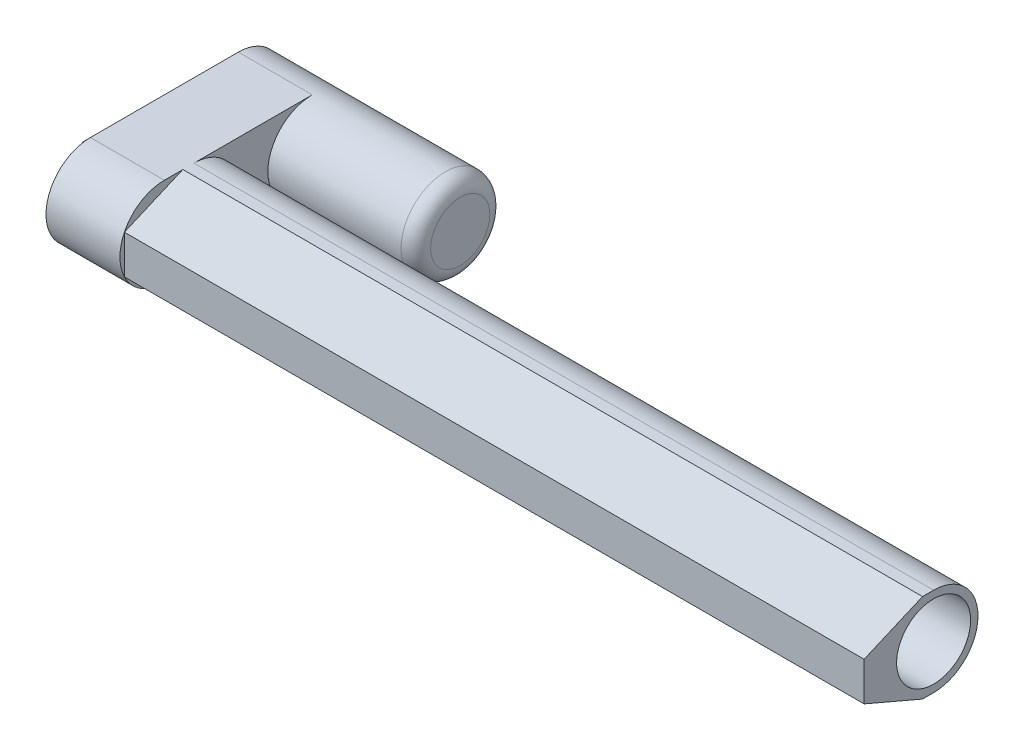
ISO-10303-21;
HEADER;
FILE_DESCRIPTION(('STEP AP214'),'2;1');
FILE_NAME('part.step','',(''),(''),'','','');
FILE_SCHEMA(('AUTOMOTIVE_DESIGN { 1 0 10303 214 1 1 1 1 }'));
ENDSEC;
DATA;
#1=APPLICATION_CONTEXT('core data for automotive mechanical design processes');
#2=APPLICATION_PROTOCOL_DEFINITION('international standard','automotive_design',2000,#1);
#3=PRODUCT_CONTEXT('',#1,'mechanical');
#4=PRODUCT('Part','Part','',(#3));
#5=PRODUCT_RELATED_PRODUCT_CATEGORY('part','',(#4));
#6=PRODUCT_DEFINITION_FORMATION('','',#4);
#7=PRODUCT_DEFINITION_CONTEXT('part definition',#1,'design');
#8=PRODUCT_DEFINITION('design','',#6,#7);
#9=PRODUCT_DEFINITION_SHAPE('','',#8);
#10=(LENGTH_UNIT() NAMED_UNIT(*) SI_UNIT(.MILLI.,.METRE.));
#11=(NAMED_UNIT(*) PLANE_ANGLE_UNIT() SI_UNIT($,.RADIAN.));
#12=(NAMED_UNIT(*) SI_UNIT($,.STERADIAN.) SOLID_ANGLE_UNIT());
#13=UNCERTAINTY_MEASURE_WITH_UNIT(LENGTH_MEASURE(1.E-05),#10,'distance_accuracy_value','');
#14=(GEOMETRIC_REPRESENTATION_CONTEXT(3) GLOBAL_UNCERTAINTY_ASSIGNED_CONTEXT((#13)) GLOBAL_UNIT_ASSIGNED_CONTEXT((#10,
#11,#12)) REPRESENTATION_CONTEXT('',''));
#15=CARTESIAN_POINT('',(0.,0.,0.));
#16=DIRECTION('',(0.,0.,1.));
#17=DIRECTION('',(1.,0.,0.));
#18=AXIS2_PLACEMENT_3D('',#15,#16,#17);
#19=CARTESIAN_POINT('',(0.,0.,0.));
#20=DIRECTION('',(1.,0.,0.));
#21=DIRECTION('',(0.,0.,-1.));
#22=AXIS2_PLACEMENT_3D('',#19,#20,#21);
#23=PLANE('',#22);
#24=DIRECTION('',(0.,1.,0.));
#25=VECTOR('',#24,1.);
#26=CARTESIAN_POINT('',(0.,-9.99999999999999,0.));
#27=LINE('',#26,#25);
#28=CARTESIAN_POINT('',(0.,-30.,0.));
#29=VERTEX_POINT('',#28);
#30=CARTESIAN_POINT('',(0.,-9.99999999999999,0.));
#31=VERTEX_POINT('',#30);
#32=EDGE_CURVE('E176',#29,#31,#27,.T.);
#33=ORIENTED_EDGE('',*,*,#32,.F.);
#34=CARTESIAN_POINT('',(0.,0.,0.));
#35=DIRECTION('',(1.,0.,0.));
#36=DIRECTION('',(0.,0.,-1.));
#37=AXIS2_PLACEMENT_3D('',#34,#35,#36);
#38=CIRCLE('',#37,30.);
#39=CARTESIAN_POINT('',(0.,30.,0.));
#40=VERTEX_POINT('',#39);
#41=EDGE_CURVE('E253',#40,#29,#38,.T.);
#42=ORIENTED_EDGE('',*,*,#41,.F.);
#43=DIRECTION('',(0.,0.,-1.));
#44=VECTOR('',#43,1.);
#45=CARTESIAN_POINT('',(0.,30.,0.));
#46=LINE('',#45,#44);
#47=CARTESIAN_POINT('',(0.,30.,-100.));
#48=VERTEX_POINT('',#47);
#49=EDGE_CURVE('E257',#40,#48,#46,.T.);
#50=ORIENTED_EDGE('',*,*,#49,.T.);
#51=CARTESIAN_POINT('',(0.,0.,-100.));
#52=DIRECTION('',(1.,0.,0.));
#53=DIRECTION('',(0.,0.,-1.));
#54=AXIS2_PLACEMENT_3D('',#51,#52,#53);
#55=CIRCLE('',#54,30.);
#56=CARTESIAN_POINT('',(0.,-30.,-100.));
#57=VERTEX_POINT('',#56);
#58=EDGE_CURVE('E262',#57,#48,#55,.T.);
#59=ORIENTED_EDGE('',*,*,#58,.F.);
#60=DIRECTION('',(0.,-1.,0.));
#61=VECTOR('',#60,1.);
#62=CARTESIAN_POINT('',(0.,-10.,-100.));
#63=LINE('',#62,#61);
#64=CARTESIAN_POINT('',(0.,-10.,-100.));
#65=VERTEX_POINT('',#64);
#66=EDGE_CURVE('E172',#65,#57,#63,.T.);
#67=ORIENTED_EDGE('',*,*,#66,.F.);
#68=DIRECTION('',(0.,0.,-1.));
#69=VECTOR('',#68,1.);
#70=CARTESIAN_POINT('',(0.,-9.99999999999999,0.));
#71=LINE('',#70,#69);
#72=EDGE_CURVE('E179',#31,#65,#71,.T.);
#73=ORIENTED_EDGE('',*,*,#72,.F.);
#74=EDGE_LOOP('',(#33,#42,#50,#59,#67,#73));
#75=FACE_BOUND('',#74,.T.);
#76=ADVANCED_FACE('F44',(#75),#23,.F.);
#77=CARTESIAN_POINT('',(50.,0.,0.));
#78=DIRECTION('',(-1.,0.,0.));
#79=DIRECTION('',(0.,0.,1.));
#80=AXIS2_PLACEMENT_3D('',#77,#78,#79);
#81=CYLINDRICAL_SURFACE('',#80,30.);
#82=CARTESIAN_POINT('',(50.,0.,0.));
#83=DIRECTION('',(1.,0.,0.));
#84=DIRECTION('',(0.,0.,-1.));
#85=AXIS2_PLACEMENT_3D('',#82,#83,#84);
#86=CIRCLE('',#85,30.);
#87=CARTESIAN_POINT('',(50.,13.076696830622,27.));
#88=VERTEX_POINT('',#87);
#89=CARTESIAN_POINT('',(50.,-13.076696830622,27.));
#90=VERTEX_POINT('',#89);
#91=EDGE_CURVE('E192',#88,#90,#86,.T.);
#92=ORIENTED_EDGE('',*,*,#91,.F.);
#93=CARTESIAN_POINT('',(50.,0.,0.));
#94=DIRECTION('',(1.,0.,0.));
#95=DIRECTION('',(0.,0.,-1.));
#96=AXIS2_PLACEMENT_3D('',#93,#94,#95);
#97=CIRCLE('',#96,30.);
#98=CARTESIAN_POINT('',(50.,30.,0.));
#99=VERTEX_POINT('',#98);
#100=EDGE_CURVE('E204',#99,#88,#97,.T.);
#101=ORIENTED_EDGE('',*,*,#100,.F.);
#102=DIRECTION('',(-1.,0.,0.));
#103=VECTOR('',#102,1.);
#104=CARTESIAN_POINT('',(50.,30.,0.));
#105=LINE('',#104,#103);
#106=EDGE_CURVE('E259',#99,#40,#105,.T.);
#107=ORIENTED_EDGE('',*,*,#106,.T.);
#108=ORIENTED_EDGE('',*,*,#41,.T.);
#109=DIRECTION('',(-1.,0.,0.));
#110=VECTOR('',#109,1.);
#111=CARTESIAN_POINT('',(50.,-30.,0.));
#112=LINE('',#111,#110);
#113=CARTESIAN_POINT('',(50.,-30.,0.));
#114=VERTEX_POINT('',#113);
#115=EDGE_CURVE('E273',#114,#29,#112,.T.);
#116=ORIENTED_EDGE('',*,*,#115,.F.);
#117=CARTESIAN_POINT('',(50.,0.,0.));
#118=DIRECTION('',(1.,0.,0.));
#119=DIRECTION('',(0.,0.,-1.));
#120=AXIS2_PLACEMENT_3D('',#117,#118,#119);
#121=CIRCLE('',#120,30.);
#122=EDGE_CURVE('E219',#90,#114,#121,.T.);
#123=ORIENTED_EDGE('',*,*,#122,.F.);
#124=EDGE_LOOP('',(#92,#101,#107,#108,#116,#123));
#125=FACE_BOUND('',#124,.T.);
#126=ADVANCED_FACE('F317',(#125),#81,.T.);
#127=CARTESIAN_POINT('',(550.,0.,0.));
#128=DIRECTION('',(1.,0.,0.));
#129=DIRECTION('',(0.,0.,-1.));
#130=AXIS2_PLACEMENT_3D('',#127,#128,#129);
#131=PLANE('',#130);
#132=CARTESIAN_POINT('',(550.,0.,-20.));
#133=DIRECTION('',(1.,0.,0.));
#134=DIRECTION('',(0.,0.,-1.));
#135=AXIS2_PLACEMENT_3D('',#132,#133,#134);
#136=CIRCLE('',#135,25.);
#137=CARTESIAN_POINT('',(550.,0.,-45.));
#138=VERTEX_POINT('',#137);
#139=EDGE_CURVE('E214',#138,#138,#136,.T.);
#140=ORIENTED_EDGE('',*,*,#139,.F.);
#141=EDGE_LOOP('',(#140));
#142=FACE_BOUND('',#141,.T.);
#143=DIRECTION('',(0.,-0.393565189985534,0.919296710116843));
#144=VECTOR('',#143,1.);
#145=CARTESIAN_POINT('',(550.,20.8198866995879,8.91331664110835));
#146=LINE('',#145,#144);
#147=CARTESIAN_POINT('',(550.,30.,-12.5297585350243));
#148=VERTEX_POINT('',#147);
#149=CARTESIAN_POINT('',(550.,13.076696830622,27.));
#150=VERTEX_POINT('',#149);
#151=EDGE_CURVE('E202',#148,#150,#146,.T.);
#152=ORIENTED_EDGE('',*,*,#151,.T.);
#153=DIRECTION('',(0.,-1.,0.));
#154=VECTOR('',#153,1.);
#155=CARTESIAN_POINT('',(550.,0.,27.));
#156=LINE('',#155,#154);
#157=CARTESIAN_POINT('',(550.,-13.076696830622,27.));
#158=VERTEX_POINT('',#157);
#159=EDGE_CURVE('E189',#150,#158,#156,.T.);
#160=ORIENTED_EDGE('',*,*,#159,.T.);
#161=DIRECTION('',(0.,-0.393565189985534,-0.919296710116843));
#162=VECTOR('',#161,1.);
#163=CARTESIAN_POINT('',(550.,-20.8198866995879,8.91331664110835));
#164=LINE('',#163,#162);
#165=CARTESIAN_POINT('',(550.,-30.,-12.5297585350242));
#166=VERTEX_POINT('',#165);
#167=EDGE_CURVE('E195',#158,#166,#164,.T.);
#168=ORIENTED_EDGE('',*,*,#167,.T.);
#169=DIRECTION('',(0.,0.,-1.));
#170=VECTOR('',#169,1.);
#171=CARTESIAN_POINT('',(550.,-30.,0.));
#172=LINE('',#171,#170);
#173=CARTESIAN_POINT('',(550.,-30.,-20.));
#174=VERTEX_POINT('',#173);
#175=EDGE_CURVE('E235',#166,#174,#172,.T.);
#176=ORIENTED_EDGE('',*,*,#175,.T.);
#177=CARTESIAN_POINT('',(550.,0.,-20.));
#178=DIRECTION('',(1.,0.,0.));
#179=DIRECTION('',(0.,0.,-1.));
#180=AXIS2_PLACEMENT_3D('',#177,#178,#179);
#181=CIRCLE('',#180,30.);
#182=CARTESIAN_POINT('',(550.,30.,-20.));
#183=VERTEX_POINT('',#182);
#184=EDGE_CURVE('E237',#174,#183,#181,.T.);
#185=ORIENTED_EDGE('',*,*,#184,.T.);
#186=DIRECTION('',(0.,0.,1.));
#187=VECTOR('',#186,1.);
#188=CARTESIAN_POINT('',(550.,30.,0.));
#189=LINE('',#188,#187);
#190=EDGE_CURVE('E239',#183,#148,#189,.T.);
#191=ORIENTED_EDGE('',*,*,#190,.T.);
#192=EDGE_LOOP('',(#152,#160,#168,#176,#185,#191));
#193=FACE_BOUND('',#192,.T.);
#194=ADVANCED_FACE('F346',(#142,#193),#131,.T.);
#195=CARTESIAN_POINT('',(50.,-30.,0.));
#196=DIRECTION('',(0.,1.,0.));
#197=DIRECTION('',(0.,0.,1.));
#198=AXIS2_PLACEMENT_3D('',#195,#196,#197);
#199=PLANE('',#198);
#200=CARTESIAN_POINT('',(-20.,-30.,-25.));
#201=DIRECTION('',(0.,-1.,0.));
#202=DIRECTION('',(0.,0.,-1.));
#203=AXIS2_PLACEMENT_3D('',#200,#201,#202);
#204=CIRCLE('',#203,10.);
#205=CARTESIAN_POINT('',(-20.,-30.,-35.));
#206=VERTEX_POINT('',#205);
#207=EDGE_CURVE('E283',#206,#206,#204,.T.);
#208=ORIENTED_EDGE('',*,*,#207,.F.);
#209=EDGE_LOOP('',(#208));
#210=FACE_BOUND('',#209,.T.);
#211=CARTESIAN_POINT('',(-20.,-30.,-75.));
#212=DIRECTION('',(0.,-1.,0.));
#213=DIRECTION('',(0.,0.,-1.));
#214=AXIS2_PLACEMENT_3D('',#211,#212,#213);
#215=CIRCLE('',#214,9.99999999999999);
#216=CARTESIAN_POINT('',(-20.,-30.,-85.));
#217=VERTEX_POINT('',#216);
#218=EDGE_CURVE('E288',#217,#217,#215,.T.);
#219=ORIENTED_EDGE('',*,*,#218,.F.);
#220=EDGE_LOOP('',(#219));
#221=FACE_BOUND('',#220,.T.);
#222=DIRECTION('',(1.,0.,0.));
#223=VECTOR('',#222,1.);
#224=CARTESIAN_POINT('',(-40.,-30.,0.));
#225=LINE('',#224,#223);
#226=CARTESIAN_POINT('',(-25.,-30.,0.));
#227=VERTEX_POINT('',#226);
#228=EDGE_CURVE('E163',#227,#29,#225,.T.);
#229=ORIENTED_EDGE('',*,*,#228,.F.);
#230=DIRECTION('',(0.393919298579168,0.,0.919145030018058));
#231=VECTOR('',#230,1.);
#232=CARTESIAN_POINT('',(-40.,-30.,-35.));
#233=LINE('',#232,#231);
#234=CARTESIAN_POINT('',(-40.,-30.,-35.));
#235=VERTEX_POINT('',#234);
#236=EDGE_CURVE('E151',#235,#227,#233,.T.);
#237=ORIENTED_EDGE('',*,*,#236,.F.);
#238=DIRECTION('',(0.,0.,1.));
#239=VECTOR('',#238,1.);
#240=CARTESIAN_POINT('',(-40.,-30.,0.));
#241=LINE('',#240,#239);
#242=CARTESIAN_POINT('',(-40.,-30.,-65.));
#243=VERTEX_POINT('',#242);
#244=EDGE_CURVE('E161',#243,#235,#241,.T.);
#245=ORIENTED_EDGE('',*,*,#244,.F.);
#246=DIRECTION('',(-0.393919298579167,0.,0.919145030018058));
#247=VECTOR('',#246,1.);
#248=CARTESIAN_POINT('',(-40.,-30.,-65.));
#249=LINE('',#248,#247);
#250=CARTESIAN_POINT('',(-25.,-30.,-100.));
#251=VERTEX_POINT('',#250);
#252=EDGE_CURVE('E61',#251,#243,#249,.T.);
#253=ORIENTED_EDGE('',*,*,#252,.F.);
#254=DIRECTION('',(1.,0.,0.));
#255=VECTOR('',#254,1.);
#256=CARTESIAN_POINT('',(-40.,-30.,-100.));
#257=LINE('',#256,#255);
#258=EDGE_CURVE('E170',#251,#57,#257,.T.);
#259=ORIENTED_EDGE('',*,*,#258,.T.);
#260=DIRECTION('',(-1.,0.,0.));
#261=VECTOR('',#260,1.);
#262=CARTESIAN_POINT('',(50.,-30.,-100.));
#263=LINE('',#262,#261);
#264=CARTESIAN_POINT('',(50.,-30.,-100.));
#265=VERTEX_POINT('',#264);
#266=EDGE_CURVE('E270',#265,#57,#263,.T.);
#267=ORIENTED_EDGE('',*,*,#266,.F.);
#268=DIRECTION('',(0.,0.,-1.));
#269=VECTOR('',#268,1.);
#270=CARTESIAN_POINT('',(50.,-30.,0.));
#271=LINE('',#270,#269);
#272=CARTESIAN_POINT('',(50.,-30.,-20.));
#273=VERTEX_POINT('',#272);
#274=EDGE_CURVE('E254',#273,#265,#271,.T.);
#275=ORIENTED_EDGE('',*,*,#274,.F.);
#276=DIRECTION('',(-1.,0.,0.));
#277=VECTOR('',#276,1.);
#278=CARTESIAN_POINT('',(550.,-30.,-20.));
#279=LINE('',#278,#277);
#280=EDGE_CURVE('E247',#174,#273,#279,.T.);
#281=ORIENTED_EDGE('',*,*,#280,.F.);
#282=ORIENTED_EDGE('',*,*,#175,.F.);
#283=DIRECTION('',(1.,0.,0.));
#284=VECTOR('',#283,1.);
#285=CARTESIAN_POINT('',(50.,-30.,-12.5297585350242));
#286=LINE('',#285,#284);
#287=CARTESIAN_POINT('',(50.,-30.,-12.5297585350242));
#288=VERTEX_POINT('',#287);
#289=EDGE_CURVE('E210',#288,#166,#286,.T.);
#290=ORIENTED_EDGE('',*,*,#289,.F.);
#291=DIRECTION('',(0.,0.,-1.));
#292=VECTOR('',#291,1.);
#293=CARTESIAN_POINT('',(50.,-30.,0.));
#294=LINE('',#293,#292);
#295=EDGE_CURVE('E221',#114,#288,#294,.T.);
#296=ORIENTED_EDGE('',*,*,#295,.F.);
#297=ORIENTED_EDGE('',*,*,#115,.T.);
#298=EDGE_LOOP('',(#229,#237,#245,#253,#259,#267,#275,#281,#282,#290,#296,#297));
#299=FACE_BOUND('',#298,.T.);
#300=ADVANCED_FACE('F160',(#210,#221,#299),#199,.F.);
#301=CARTESIAN_POINT('',(50.,30.,0.));
#302=DIRECTION('',(0.,1.,0.));
#303=DIRECTION('',(0.,0.,1.));
#304=AXIS2_PLACEMENT_3D('',#301,#302,#303);
#305=PLANE('',#304);
#306=DIRECTION('',(0.,0.,1.));
#307=VECTOR('',#306,1.);
#308=CARTESIAN_POINT('',(50.,30.,0.));
#309=LINE('',#308,#307);
#310=CARTESIAN_POINT('',(50.,30.,-12.5297585350243));
#311=VERTEX_POINT('',#310);
#312=EDGE_CURVE('E201',#311,#99,#309,.T.);
#313=ORIENTED_EDGE('',*,*,#312,.F.);
#314=DIRECTION('',(1.,0.,0.));
#315=VECTOR('',#314,1.);
#316=CARTESIAN_POINT('',(50.,30.,-12.5297585350243));
#317=LINE('',#316,#315);
#318=EDGE_CURVE('E207',#311,#148,#317,.T.);
#319=ORIENTED_EDGE('',*,*,#318,.T.);
#320=ORIENTED_EDGE('',*,*,#190,.F.);
#321=DIRECTION('',(-1.,0.,0.));
#322=VECTOR('',#321,1.);
#323=CARTESIAN_POINT('',(550.,30.,-20.));
#324=LINE('',#323,#322);
#325=CARTESIAN_POINT('',(50.,30.,-20.));
#326=VERTEX_POINT('',#325);
#327=EDGE_CURVE('E242',#183,#326,#324,.T.);
#328=ORIENTED_EDGE('',*,*,#327,.T.);
#329=DIRECTION('',(0.,0.,-1.));
#330=VECTOR('',#329,1.);
#331=CARTESIAN_POINT('',(50.,30.,0.));
#332=LINE('',#331,#330);
#333=CARTESIAN_POINT('',(50.,30.,-100.));
#334=VERTEX_POINT('',#333);
#335=EDGE_CURVE('E256',#326,#334,#332,.T.);
#336=ORIENTED_EDGE('',*,*,#335,.T.);
#337=DIRECTION('',(-1.,0.,0.));
#338=VECTOR('',#337,1.);
#339=CARTESIAN_POINT('',(50.,30.,-100.));
#340=LINE('',#339,#338);
#341=EDGE_CURVE('E268',#334,#48,#340,.T.);
#342=ORIENTED_EDGE('',*,*,#341,.T.);
#343=ORIENTED_EDGE('',*,*,#49,.F.);
#344=ORIENTED_EDGE('',*,*,#106,.F.);
#345=EDGE_LOOP('',(#313,#319,#320,#328,#336,#342,#343,#344));
#346=FACE_BOUND('',#345,.T.);
#347=ADVANCED_FACE('F322',(#346),#305,.T.);
#348=CARTESIAN_POINT('',(50.,0.,-100.));
#349=DIRECTION('',(-1.,0.,0.));
#350=DIRECTION('',(0.,0.,1.));
#351=AXIS2_PLACEMENT_3D('',#348,#349,#350);
#352=CYLINDRICAL_SURFACE('',#351,30.);
#353=CARTESIAN_POINT('',(140.,0.,-100.));
#354=DIRECTION('',(1.,0.,0.));
#355=DIRECTION('',(0.,0.,-1.));
#356=AXIS2_PLACEMENT_3D('',#353,#354,#355);
#357=CIRCLE('',#356,30.);
#358=CARTESIAN_POINT('',(140.,0.,-130.));
#359=VERTEX_POINT('',#358);
#360=EDGE_CURVE('E278',#359,#359,#357,.F.);
#361=ORIENTED_EDGE('',*,*,#360,.T.);
#362=EDGE_LOOP('',(#361));
#363=FACE_BOUND('',#362,.T.);
#364=ORIENTED_EDGE('',*,*,#58,.T.);
#365=ORIENTED_EDGE('',*,*,#341,.F.);
#366=CARTESIAN_POINT('',(50.,0.,-100.));
#367=DIRECTION('',(1.,0.,0.));
#368=DIRECTION('',(0.,0.,-1.));
#369=AXIS2_PLACEMENT_3D('',#366,#367,#368);
#370=CIRCLE('',#369,30.);
#371=EDGE_CURVE('E250',#334,#265,#370,.T.);
#372=ORIENTED_EDGE('',*,*,#371,.T.);
#373=ORIENTED_EDGE('',*,*,#266,.T.);
#374=EDGE_LOOP('',(#364,#365,#372,#373));
#375=FACE_BOUND('',#374,.T.);
#376=ADVANCED_FACE('F334',(#363,#375),#352,.T.);
#377=CARTESIAN_POINT('',(50.,0.,0.));
#378=DIRECTION('',(1.,0.,0.));
#379=DIRECTION('',(0.,0.,-1.));
#380=AXIS2_PLACEMENT_3D('',#377,#378,#379);
#381=PLANE('',#380);
#382=ORIENTED_EDGE('',*,*,#335,.F.);
#383=CARTESIAN_POINT('',(50.,0.,-20.));
#384=DIRECTION('',(1.,0.,0.));
#385=DIRECTION('',(0.,0.,-1.));
#386=AXIS2_PLACEMENT_3D('',#383,#384,#385);
#387=CIRCLE('',#386,30.);
#388=EDGE_CURVE('E232',#273,#326,#387,.T.);
#389=ORIENTED_EDGE('',*,*,#388,.F.);
#390=ORIENTED_EDGE('',*,*,#274,.T.);
#391=ORIENTED_EDGE('',*,*,#371,.F.);
#392=EDGE_LOOP('',(#382,#389,#390,#391));
#393=FACE_BOUND('',#392,.T.);
#394=ADVANCED_FACE('F337',(#393),#381,.T.);
#395=CARTESIAN_POINT('',(150.,0.,-100.));
#396=DIRECTION('',(1.,0.,0.));
#397=DIRECTION('',(0.,0.,-1.));
#398=AXIS2_PLACEMENT_3D('',#395,#396,#397);
#399=PLANE('',#398);
#400=CARTESIAN_POINT('',(150.,0.,-100.));
#401=DIRECTION('',(1.,0.,0.));
#402=DIRECTION('',(0.,0.,-1.));
#403=AXIS2_PLACEMENT_3D('',#400,#401,#402);
#404=CIRCLE('',#403,20.);
#405=CARTESIAN_POINT('',(150.,0.,-120.));
#406=VERTEX_POINT('',#405);
#407=EDGE_CURVE('E275',#406,#406,#404,.T.);
#408=ORIENTED_EDGE('',*,*,#407,.T.);
#409=EDGE_LOOP('',(#408));
#410=FACE_BOUND('',#409,.T.);
#411=ADVANCED_FACE('F429',(#410),#399,.T.);
#412=CARTESIAN_POINT('',(550.,0.,-20.));
#413=DIRECTION('',(-1.,0.,0.));
#414=DIRECTION('',(0.,0.,1.));
#415=AXIS2_PLACEMENT_3D('',#412,#413,#414);
#416=CYLINDRICAL_SURFACE('',#415,30.);
#417=ORIENTED_EDGE('',*,*,#388,.T.);
#418=ORIENTED_EDGE('',*,*,#327,.F.);
#419=ORIENTED_EDGE('',*,*,#184,.F.);
#420=ORIENTED_EDGE('',*,*,#280,.T.);
#421=EDGE_LOOP('',(#417,#418,#419,#420));
#422=FACE_BOUND('',#421,.T.);
#423=ADVANCED_FACE('F342',(#422),#416,.T.);
#424=CARTESIAN_POINT('',(50.,0.,-20.));
#425=DIRECTION('',(1.,0.,0.));
#426=DIRECTION('',(0.,0.,-1.));
#427=AXIS2_PLACEMENT_3D('',#424,#425,#426);
#428=CYLINDRICAL_SURFACE('',#427,25.);
#429=CARTESIAN_POINT('',(50.,0.,-20.));
#430=DIRECTION('',(1.,0.,0.));
#431=DIRECTION('',(0.,0.,-1.));
#432=AXIS2_PLACEMENT_3D('',#429,#430,#431);
#433=CIRCLE('',#432,25.);
#434=CARTESIAN_POINT('',(50.,0.,-45.));
#435=VERTEX_POINT('',#434);
#436=EDGE_CURVE('E229',#435,#435,#433,.T.);
#437=ORIENTED_EDGE('',*,*,#436,.F.);
#438=EDGE_LOOP('',(#437));
#439=FACE_BOUND('',#438,.T.);
#440=ORIENTED_EDGE('',*,*,#139,.T.);
#441=EDGE_LOOP('',(#440));
#442=FACE_BOUND('',#441,.T.);
#443=ADVANCED_FACE('F435',(#439,#442),#428,.F.);
#444=CARTESIAN_POINT('',(50.,0.,-20.));
#445=DIRECTION('',(1.,0.,0.));
#446=DIRECTION('',(0.,0.,-1.));
#447=AXIS2_PLACEMENT_3D('',#444,#445,#446);
#448=PLANE('',#447);
#449=ORIENTED_EDGE('',*,*,#436,.T.);
#450=EDGE_LOOP('',(#449));
#451=FACE_BOUND('',#450,.T.);
#452=ADVANCED_FACE('F440',(#451),#448,.T.);
#453=CARTESIAN_POINT('',(50.,-20.8198866995879,8.91331664110835));
#454=DIRECTION('',(0.,-0.919296710116843,0.393565189985534));
#455=DIRECTION('',(0.,-0.393565189985534,-0.919296710116843));
#456=AXIS2_PLACEMENT_3D('',#453,#454,#455);
#457=PLANE('',#456);
#458=ORIENTED_EDGE('',*,*,#167,.F.);
#459=DIRECTION('',(1.,0.,0.));
#460=VECTOR('',#459,1.);
#461=CARTESIAN_POINT('',(50.,-13.076696830622,27.));
#462=LINE('',#461,#460);
#463=EDGE_CURVE('E224',#90,#158,#462,.T.);
#464=ORIENTED_EDGE('',*,*,#463,.F.);
#465=DIRECTION('',(0.,-0.393565189985534,-0.919296710116843));
#466=VECTOR('',#465,1.);
#467=CARTESIAN_POINT('',(50.,-20.8198866995879,8.91331664110835));
#468=LINE('',#467,#466);
#469=EDGE_CURVE('E217',#90,#288,#468,.T.);
#470=ORIENTED_EDGE('',*,*,#469,.T.);
#471=ORIENTED_EDGE('',*,*,#289,.T.);
#472=EDGE_LOOP('',(#458,#464,#470,#471));
#473=FACE_BOUND('',#472,.T.);
#474=ADVANCED_FACE('F349',(#473),#457,.T.);
#475=CARTESIAN_POINT('',(50.,0.,0.));
#476=DIRECTION('',(1.,0.,0.));
#477=DIRECTION('',(0.,0.,-1.));
#478=AXIS2_PLACEMENT_3D('',#475,#476,#477);
#479=PLANE('',#478);
#480=ORIENTED_EDGE('',*,*,#469,.F.);
#481=ORIENTED_EDGE('',*,*,#122,.T.);
#482=ORIENTED_EDGE('',*,*,#295,.T.);
#483=EDGE_LOOP('',(#480,#481,#482));
#484=FACE_BOUND('',#483,.T.);
#485=ADVANCED_FACE('F353',(#484),#479,.T.);
#486=CARTESIAN_POINT('',(50.,20.8198866995879,8.91331664110835));
#487=DIRECTION('',(0.,0.919296710116843,0.393565189985534));
#488=DIRECTION('',(0.,-0.393565189985534,0.919296710116843));
#489=AXIS2_PLACEMENT_3D('',#486,#487,#488);
#490=PLANE('',#489);
#491=ORIENTED_EDGE('',*,*,#151,.F.);
#492=ORIENTED_EDGE('',*,*,#318,.F.);
#493=DIRECTION('',(0.,-0.393565189985534,0.919296710116843));
#494=VECTOR('',#493,1.);
#495=CARTESIAN_POINT('',(50.,20.8198866995879,8.91331664110835));
#496=LINE('',#495,#494);
#497=EDGE_CURVE('E198',#311,#88,#496,.T.);
#498=ORIENTED_EDGE('',*,*,#497,.T.);
#499=DIRECTION('',(1.,0.,0.));
#500=VECTOR('',#499,1.);
#501=CARTESIAN_POINT('',(50.,13.076696830622,27.));
#502=LINE('',#501,#500);
#503=EDGE_CURVE('E211',#88,#150,#502,.T.);
#504=ORIENTED_EDGE('',*,*,#503,.T.);
#505=EDGE_LOOP('',(#491,#492,#498,#504));
#506=FACE_BOUND('',#505,.T.);
#507=ADVANCED_FACE('F358',(#506),#490,.T.);
#508=CARTESIAN_POINT('',(50.,0.,0.));
#509=DIRECTION('',(1.,0.,0.));
#510=DIRECTION('',(0.,0.,-1.));
#511=AXIS2_PLACEMENT_3D('',#508,#509,#510);
#512=PLANE('',#511);
#513=ORIENTED_EDGE('',*,*,#497,.F.);
#514=ORIENTED_EDGE('',*,*,#312,.T.);
#515=ORIENTED_EDGE('',*,*,#100,.T.);
#516=EDGE_LOOP('',(#513,#514,#515));
#517=FACE_BOUND('',#516,.T.);
#518=ADVANCED_FACE('F360',(#517),#512,.T.);
#519=CARTESIAN_POINT('',(50.,0.,27.));
#520=DIRECTION('',(0.,0.,1.));
#521=DIRECTION('',(1.,0.,0.));
#522=AXIS2_PLACEMENT_3D('',#519,#520,#521);
#523=PLANE('',#522);
#524=ORIENTED_EDGE('',*,*,#159,.F.);
#525=ORIENTED_EDGE('',*,*,#503,.F.);
#526=DIRECTION('',(0.,-1.,0.));
#527=VECTOR('',#526,1.);
#528=CARTESIAN_POINT('',(50.,0.,27.));
#529=LINE('',#528,#527);
#530=EDGE_CURVE('E190',#88,#90,#529,.T.);
#531=ORIENTED_EDGE('',*,*,#530,.T.);
#532=ORIENTED_EDGE('',*,*,#463,.T.);
#533=EDGE_LOOP('',(#524,#525,#531,#532));
#534=FACE_BOUND('',#533,.T.);
#535=ADVANCED_FACE('F362',(#534),#523,.T.);
#536=CARTESIAN_POINT('',(50.,0.,0.));
#537=DIRECTION('',(1.,0.,0.));
#538=DIRECTION('',(0.,0.,-1.));
#539=AXIS2_PLACEMENT_3D('',#536,#537,#538);
#540=PLANE('',#539);
#541=ORIENTED_EDGE('',*,*,#530,.F.);
#542=ORIENTED_EDGE('',*,*,#91,.T.);
#543=EDGE_LOOP('',(#541,#542));
#544=FACE_BOUND('',#543,.T.);
#545=ADVANCED_FACE('F368',(#544),#540,.T.);
#546=CARTESIAN_POINT('',(140.,0.,-100.));
#547=DIRECTION('',(1.,0.,0.));
#548=DIRECTION('',(0.,0.,-1.));
#549=AXIS2_PLACEMENT_3D('',#546,#547,#548);
#550=TOROIDAL_SURFACE('',#549,20.,10.);
#551=ORIENTED_EDGE('',*,*,#360,.F.);
#552=EDGE_LOOP('',(#551));
#553=FACE_BOUND('',#552,.T.);
#554=ORIENTED_EDGE('',*,*,#407,.F.);
#555=EDGE_LOOP('',(#554));
#556=FACE_BOUND('',#555,.T.);
#557=ADVANCED_FACE('F46',(#553,#556),#550,.T.);
#558=CARTESIAN_POINT('',(-40.,-9.99999999999999,0.));
#559=DIRECTION('',(0.,0.,-1.));
#560=DIRECTION('',(-1.,0.,0.));
#561=AXIS2_PLACEMENT_3D('',#558,#559,#560);
#562=PLANE('',#561);
#563=DIRECTION('',(1.,0.,0.));
#564=VECTOR('',#563,1.);
#565=CARTESIAN_POINT('',(-40.,-9.99999999999999,0.));
#566=LINE('',#565,#564);
#567=CARTESIAN_POINT('',(-25.,-9.99999999999999,0.));
#568=VERTEX_POINT('',#567);
#569=EDGE_CURVE('E187',#568,#31,#566,.T.);
#570=ORIENTED_EDGE('',*,*,#569,.F.);
#571=DIRECTION('',(0.,-1.,0.));
#572=VECTOR('',#571,1.);
#573=CARTESIAN_POINT('',(-25.,10.,0.));
#574=LINE('',#573,#572);
#575=EDGE_CURVE('E164',#568,#227,#574,.T.);
#576=ORIENTED_EDGE('',*,*,#575,.T.);
#577=ORIENTED_EDGE('',*,*,#228,.T.);
#578=ORIENTED_EDGE('',*,*,#32,.T.);
#579=EDGE_LOOP('',(#570,#576,#577,#578));
#580=FACE_BOUND('',#579,.T.);
#581=ADVANCED_FACE('F305',(#580),#562,.F.);
#582=CARTESIAN_POINT('',(-40.,-9.99999999999999,0.));
#583=DIRECTION('',(0.,-1.,0.));
#584=DIRECTION('',(0.,0.,-1.));
#585=AXIS2_PLACEMENT_3D('',#582,#583,#584);
#586=PLANE('',#585);
#587=CARTESIAN_POINT('',(-20.,-9.99999999999999,-25.));
#588=DIRECTION('',(0.,-1.,0.));
#589=DIRECTION('',(0.,0.,-1.));
#590=AXIS2_PLACEMENT_3D('',#587,#588,#589);
#591=CIRCLE('',#590,10.);
#592=CARTESIAN_POINT('',(-20.,-9.99999999999999,-35.));
#593=VERTEX_POINT('',#592);
#594=EDGE_CURVE('E48',#593,#593,#591,.T.);
#595=ORIENTED_EDGE('',*,*,#594,.T.);
#596=EDGE_LOOP('',(#595));
#597=FACE_BOUND('',#596,.T.);
#598=CARTESIAN_POINT('',(-20.,-9.99999999999999,-75.));
#599=DIRECTION('',(0.,-1.,0.));
#600=DIRECTION('',(0.,0.,-1.));
#601=AXIS2_PLACEMENT_3D('',#598,#599,#600);
#602=CIRCLE('',#601,9.99999999999999);
#603=CARTESIAN_POINT('',(-20.,-10.,-85.));
#604=VERTEX_POINT('',#603);
#605=EDGE_CURVE('E281',#604,#604,#602,.T.);
#606=ORIENTED_EDGE('',*,*,#605,.T.);
#607=EDGE_LOOP('',(#606));
#608=FACE_BOUND('',#607,.T.);
#609=DIRECTION('',(0.,0.,-1.));
#610=VECTOR('',#609,1.);
#611=CARTESIAN_POINT('',(-40.,-9.99999999999999,0.));
#612=LINE('',#611,#610);
#613=CARTESIAN_POINT('',(-40.,-9.99999999999999,-35.));
#614=VERTEX_POINT('',#613);
#615=CARTESIAN_POINT('',(-40.,-9.99999999999998,-65.));
#616=VERTEX_POINT('',#615);
#617=EDGE_CURVE('E168',#614,#616,#612,.T.);
#618=ORIENTED_EDGE('',*,*,#617,.F.);
#619=DIRECTION('',(0.393919298579168,0.,0.919145030018058));
#620=VECTOR('',#619,1.);
#621=CARTESIAN_POINT('',(-27.3275862068966,-9.99999999999999,-5.43103448275862));
#622=LINE('',#621,#620);
#623=EDGE_CURVE('E69',#614,#568,#622,.T.);
#624=ORIENTED_EDGE('',*,*,#623,.T.);
#625=ORIENTED_EDGE('',*,*,#569,.T.);
#626=ORIENTED_EDGE('',*,*,#72,.T.);
#627=DIRECTION('',(1.,0.,0.));
#628=VECTOR('',#627,1.);
#629=CARTESIAN_POINT('',(-40.,-10.,-100.));
#630=LINE('',#629,#628);
#631=CARTESIAN_POINT('',(-25.,-10.,-100.));
#632=VERTEX_POINT('',#631);
#633=EDGE_CURVE('E185',#632,#65,#630,.T.);
#634=ORIENTED_EDGE('',*,*,#633,.F.);
#635=DIRECTION('',(-0.393919298579168,0.,0.919145030018058));
#636=VECTOR('',#635,1.);
#637=CARTESIAN_POINT('',(-63.5344827586207,-9.99999999999999,-10.0862068965517));
#638=LINE('',#637,#636);
#639=EDGE_CURVE('E296',#632,#616,#638,.T.);
#640=ORIENTED_EDGE('',*,*,#639,.T.);
#641=EDGE_LOOP('',(#618,#624,#625,#626,#634,#640));
#642=FACE_BOUND('',#641,.T.);
#643=ADVANCED_FACE('F302',(#597,#608,#642),#586,.F.);
#644=CARTESIAN_POINT('',(-40.,-10.,-100.));
#645=DIRECTION('',(0.,0.,1.));
#646=DIRECTION('',(1.,0.,0.));
#647=AXIS2_PLACEMENT_3D('',#644,#645,#646);
#648=PLANE('',#647);
#649=ORIENTED_EDGE('',*,*,#258,.F.);
#650=DIRECTION('',(0.,-1.,0.));
#651=VECTOR('',#650,1.);
#652=CARTESIAN_POINT('',(-25.,9.99999999999999,-100.));
#653=LINE('',#652,#651);
#654=EDGE_CURVE('E165',#632,#251,#653,.T.);
#655=ORIENTED_EDGE('',*,*,#654,.F.);
#656=ORIENTED_EDGE('',*,*,#633,.T.);
#657=ORIENTED_EDGE('',*,*,#66,.T.);
#658=EDGE_LOOP('',(#649,#655,#656,#657));
#659=FACE_BOUND('',#658,.T.);
#660=ADVANCED_FACE('F328',(#659),#648,.F.);
#661=CARTESIAN_POINT('',(-40.,0.,0.));
#662=DIRECTION('',(1.,0.,0.));
#663=DIRECTION('',(0.,0.,-1.));
#664=AXIS2_PLACEMENT_3D('',#661,#662,#663);
#665=PLANE('',#664);
#666=ORIENTED_EDGE('',*,*,#244,.T.);
#667=DIRECTION('',(0.,1.,0.));
#668=VECTOR('',#667,1.);
#669=CARTESIAN_POINT('',(-40.,0.,-35.));
#670=LINE('',#669,#668);
#671=EDGE_CURVE('E12',#235,#614,#670,.T.);
#672=ORIENTED_EDGE('',*,*,#671,.T.);
#673=ORIENTED_EDGE('',*,*,#617,.T.);
#674=DIRECTION('',(0.,-1.,0.));
#675=VECTOR('',#674,1.);
#676=CARTESIAN_POINT('',(-40.,0.,-65.));
#677=LINE('',#676,#675);
#678=EDGE_CURVE('E53',#616,#243,#677,.T.);
#679=ORIENTED_EDGE('',*,*,#678,.T.);
#680=EDGE_LOOP('',(#666,#672,#673,#679));
#681=FACE_BOUND('',#680,.T.);
#682=ADVANCED_FACE('F167',(#681),#665,.F.);
#683=CARTESIAN_POINT('',(-40.,9.99999999999999,-65.));
#684=DIRECTION('',(0.919145030018058,0.,0.393919298579168));
#685=DIRECTION('',(0.393919298579168,0.,-0.919145030018058));
#686=AXIS2_PLACEMENT_3D('',#683,#684,#685);
#687=PLANE('',#686);
#688=ORIENTED_EDGE('',*,*,#654,.T.);
#689=ORIENTED_EDGE('',*,*,#252,.T.);
#690=ORIENTED_EDGE('',*,*,#678,.F.);
#691=ORIENTED_EDGE('',*,*,#639,.F.);
#692=EDGE_LOOP('',(#688,#689,#690,#691));
#693=FACE_BOUND('',#692,.T.);
#694=ADVANCED_FACE('F331',(#693),#687,.F.);
#695=CARTESIAN_POINT('',(-40.,10.,-35.));
#696=DIRECTION('',(0.919145030018058,0.,-0.393919298579168));
#697=DIRECTION('',(-0.393919298579168,0.,-0.919145030018058));
#698=AXIS2_PLACEMENT_3D('',#695,#696,#697);
#699=PLANE('',#698);
#700=ORIENTED_EDGE('',*,*,#671,.F.);
#701=ORIENTED_EDGE('',*,*,#236,.T.);
#702=ORIENTED_EDGE('',*,*,#575,.F.);
#703=ORIENTED_EDGE('',*,*,#623,.F.);
#704=EDGE_LOOP('',(#700,#701,#702,#703));
#705=FACE_BOUND('',#704,.T.);
#706=ADVANCED_FACE('F150',(#705),#699,.F.);
#707=CARTESIAN_POINT('',(-20.,9.99999999999999,-75.));
#708=DIRECTION('',(0.,-1.,0.));
#709=DIRECTION('',(0.,0.,-1.));
#710=AXIS2_PLACEMENT_3D('',#707,#708,#709);
#711=CYLINDRICAL_SURFACE('',#710,9.99999999999999);
#712=ORIENTED_EDGE('',*,*,#218,.T.);
#713=EDGE_LOOP('',(#712));
#714=FACE_BOUND('',#713,.T.);
#715=ORIENTED_EDGE('',*,*,#605,.F.);
#716=EDGE_LOOP('',(#715));
#717=FACE_BOUND('',#716,.T.);
#718=ADVANCED_FACE('F395',(#714,#717),#711,.F.);
#719=CARTESIAN_POINT('',(-20.,10.,-25.));
#720=DIRECTION('',(0.,-1.,0.));
#721=DIRECTION('',(0.,0.,-1.));
#722=AXIS2_PLACEMENT_3D('',#719,#720,#721);
#723=CYLINDRICAL_SURFACE('',#722,10.);
#724=ORIENTED_EDGE('',*,*,#207,.T.);
#725=EDGE_LOOP('',(#724));
#726=FACE_BOUND('',#725,.T.);
#727=ORIENTED_EDGE('',*,*,#594,.F.);
#728=EDGE_LOOP('',(#727));
#729=FACE_BOUND('',#728,.T.);
#730=ADVANCED_FACE('F398',(#726,#729),#723,.F.);
#731=CLOSED_SHELL('',(#76,#126,#194,#300,#347,#376,#394,#411,#423,#443,#452,#474,#485,#507,#518,
#535,#545,#557,#581,#643,#660,#682,#694,#706,#718,#730));
#732=MANIFOLD_SOLID_BREP('B2',#731);
#733=ADVANCED_BREP_SHAPE_REPRESENTATION('',(#18,#732),#14);
#734=SHAPE_DEFINITION_REPRESENTATION(#9,#733);
ENDSEC;
END-ISO-10303-21;
